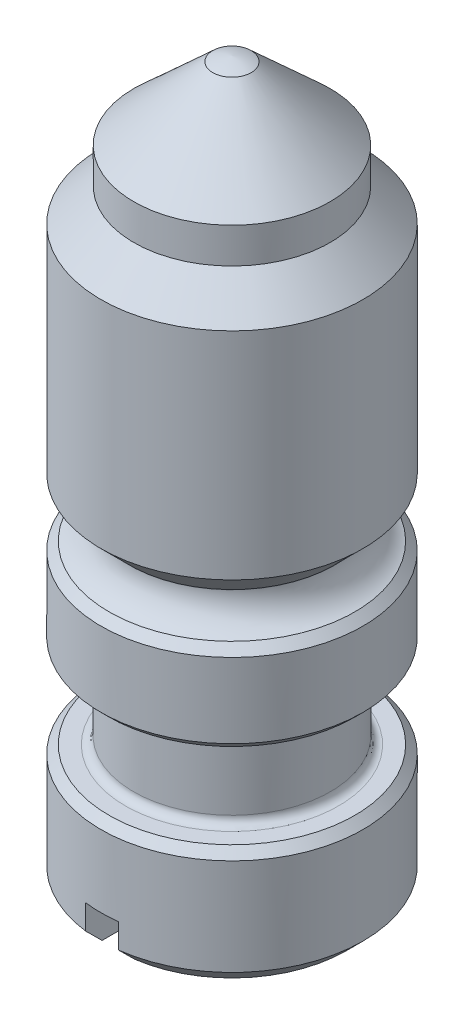
ISO-10303-21;
HEADER;
FILE_DESCRIPTION(('STEP AP214'),'2;1');
FILE_NAME('part.step','',(''),(''),'','','');
FILE_SCHEMA(('AUTOMOTIVE_DESIGN { 1 0 10303 214 1 1 1 1 }'));
ENDSEC;
DATA;
#1=APPLICATION_CONTEXT('core data for automotive mechanical design processes');
#2=APPLICATION_PROTOCOL_DEFINITION('international standard','automotive_design',2000,#1);
#3=PRODUCT_CONTEXT('',#1,'mechanical');
#4=PRODUCT('Part','Part','',(#3));
#5=PRODUCT_RELATED_PRODUCT_CATEGORY('part','',(#4));
#6=PRODUCT_DEFINITION_FORMATION('','',#4);
#7=PRODUCT_DEFINITION_CONTEXT('part definition',#1,'design');
#8=PRODUCT_DEFINITION('design','',#6,#7);
#9=PRODUCT_DEFINITION_SHAPE('','',#8);
#10=(LENGTH_UNIT() NAMED_UNIT(*) SI_UNIT(.MILLI.,.METRE.));
#11=(NAMED_UNIT(*) PLANE_ANGLE_UNIT() SI_UNIT($,.RADIAN.));
#12=(NAMED_UNIT(*) SI_UNIT($,.STERADIAN.) SOLID_ANGLE_UNIT());
#13=UNCERTAINTY_MEASURE_WITH_UNIT(LENGTH_MEASURE(1.E-05),#10,'distance_accuracy_value','');
#14=(GEOMETRIC_REPRESENTATION_CONTEXT(3) GLOBAL_UNCERTAINTY_ASSIGNED_CONTEXT((#13)) GLOBAL_UNIT_ASSIGNED_CONTEXT((#10,
#11,#12)) REPRESENTATION_CONTEXT('',''));
#15=CARTESIAN_POINT('',(0.,0.,0.));
#16=DIRECTION('',(0.,0.,1.));
#17=DIRECTION('',(1.,0.,0.));
#18=AXIS2_PLACEMENT_3D('',#15,#16,#17);
#19=CARTESIAN_POINT('',(0.,0.,0.));
#20=DIRECTION('',(0.,-1.,0.));
#21=DIRECTION('',(1.,0.,0.));
#22=AXIS2_PLACEMENT_3D('',#19,#20,#21);
#23=PLANE('',#22);
#24=DIRECTION('',(0.,0.,1.));
#25=VECTOR('',#24,1.);
#26=CARTESIAN_POINT('',(0.5,0.,-30.));
#27=LINE('',#26,#25);
#28=CARTESIAN_POINT('',(0.5,0.,-3.4612806175698));
#29=VERTEX_POINT('',#28);
#30=CARTESIAN_POINT('',(0.5,0.,3.4612806175698));
#31=VERTEX_POINT('',#30);
#32=EDGE_CURVE('E118',#29,#31,#27,.T.);
#33=ORIENTED_EDGE('',*,*,#32,.F.);
#34=CARTESIAN_POINT('',(0.,0.,0.));
#35=DIRECTION('',(0.,-1.,0.));
#36=DIRECTION('',(1.,0.,0.));
#37=AXIS2_PLACEMENT_3D('',#34,#35,#36);
#38=CIRCLE('',#37,3.49720795972507);
#39=EDGE_CURVE('E257',#29,#31,#38,.T.);
#40=ORIENTED_EDGE('',*,*,#39,.T.);
#41=EDGE_LOOP('',(#33,#40));
#42=FACE_BOUND('',#41,.T.);
#43=ADVANCED_FACE('F53',(#42),#23,.T.);
#44=CARTESIAN_POINT('',(0.,0.500000000000004,0.));
#45=DIRECTION('',(0.,1.,0.));
#46=DIRECTION('',(-1.,0.,0.));
#47=AXIS2_PLACEMENT_3D('',#44,#45,#46);
#48=CONICAL_SURFACE('',#47,3.99720795972507,0.785398163397449);
#49=CARTESIAN_POINT('',(0.5,0.500700000000004,-3.96651837943972));
#50=CARTESIAN_POINT('',(0.5,0.382162649200017,-3.84703862693179));
#51=CARTESIAN_POINT('',(0.5,0.263663328560872,-3.72752109644653));
#52=CARTESIAN_POINT('',(0.5,0.0267449401066083,-3.48834083826857));
#53=CARTESIAN_POINT('',(0.5,-0.0916740963278661,-3.36867807949517));
#54=CARTESIAN_POINT('',(0.5,-0.32901277920136,-3.12854544745988));
#55=CARTESIAN_POINT('',(0.5,-0.44793159702757,-3.00807475473469));
#56=CARTESIAN_POINT('',(0.5,-0.685518199811289,-2.76695112386457));
#57=CARTESIAN_POINT('',(0.5,-0.804186044562586,-2.64629824461754));
#58=CARTESIAN_POINT('',(0.5,-1.07827412353931,-2.36690025236017));
#59=CARTESIAN_POINT('',(0.5,-1.23358098505172,-2.20804363582366));
#60=CARTESIAN_POINT('',(0.5,-1.46585453324438,-1.96894497500237));
#61=CARTESIAN_POINT('',(0.5,-1.54320089466389,-1.8890719504622));
#62=CARTESIAN_POINT('',(0.5,-1.69751445923931,-1.72897558033324));
#63=CARTESIAN_POINT('',(0.5,-1.77448170027753,-1.6487522713212));
#64=CARTESIAN_POINT('',(0.5,-1.92753017553228,-1.48811310695071));
#65=CARTESIAN_POINT('',(0.5,-2.00361378404025,-1.407699515119));
#66=CARTESIAN_POINT('',(0.5,-2.15492880867202,-1.24601063177072));
#67=CARTESIAN_POINT('',(0.5,-2.23015988288688,-1.16473501819207));
#68=CARTESIAN_POINT('',(0.5,-2.34175217527641,-1.04180884388882));
#69=CARTESIAN_POINT('',(0.5,-2.3787094866305,-1.0007002419622));
#70=CARTESIAN_POINT('',(0.5,-2.45206232824094,-0.917985717558046));
#71=CARTESIAN_POINT('',(0.5,-2.48845788068998,-0.876379814842564));
#72=CARTESIAN_POINT('',(0.5,-2.56041345592791,-0.792495172606358));
#73=CARTESIAN_POINT('',(0.5,-2.59597398591856,-0.750216869138712));
#74=CARTESIAN_POINT('',(0.5,-2.66585622754197,-0.664651756728776));
#75=CARTESIAN_POINT('',(0.5,-2.70017825037921,-0.62136520569488));
#76=CARTESIAN_POINT('',(0.5,-2.74397216554048,-0.563422478281631));
#77=CARTESIAN_POINT('',(0.5,-2.75436408650383,-0.549462250981517));
#78=CARTESIAN_POINT('',(0.5,-2.77490234929231,-0.521361268943264));
#79=CARTESIAN_POINT('',(0.5,-2.78504867643563,-0.507220503489199));
#80=CARTESIAN_POINT('',(0.5,-2.81506384704984,-0.464472453232856));
#81=CARTESIAN_POINT('',(0.5,-2.8344971139177,-0.435554793331342));
#82=CARTESIAN_POINT('',(0.5,-2.87146068621362,-0.376925584117741));
#83=CARTESIAN_POINT('',(0.5,-2.88900841920581,-0.347225177104602));
#84=CARTESIAN_POINT('',(0.5,-2.92153281106069,-0.286461873986791));
#85=CARTESIAN_POINT('',(0.5,-2.93651278681223,-0.255400801676508));
#86=CARTESIAN_POINT('',(0.5,-2.96206655520625,-0.192772285233641));
#87=CARTESIAN_POINT('',(0.5,-2.97278118504339,-0.161264678483901));
#88=CARTESIAN_POINT('',(0.5,-2.98882239369144,-0.0970015844244616));
#89=CARTESIAN_POINT('',(0.5,-2.99417787989488,-0.064253791910037));
#90=CARTESIAN_POINT('',(0.5,-2.99830188173731,0.00199595398083887));
#91=CARTESIAN_POINT('',(0.5,-2.99700815695685,0.0355020997448063));
#92=CARTESIAN_POINT('',(0.5,-2.98803686977998,0.101719294008));
#93=CARTESIAN_POINT('',(0.5,-2.98033389282742,0.134426642708083));
#94=CARTESIAN_POINT('',(0.5,-2.96261773606055,0.190577409896189));
#95=CARTESIAN_POINT('',(0.5,-2.95360487047794,0.214357896203521));
#96=CARTESIAN_POINT('',(0.5,-2.93355246588525,0.261059362661849));
#97=CARTESIAN_POINT('',(0.5,-2.92251133941815,0.283979652522861));
#98=CARTESIAN_POINT('',(0.5,-2.89890850746196,0.329143337623807));
#99=CARTESIAN_POINT('',(0.5,-2.88634006768259,0.351383150875618));
#100=CARTESIAN_POINT('',(0.5,-2.86012413313005,0.395198055680793));
#101=CARTESIAN_POINT('',(0.5,-2.84647709985929,0.416773426099453));
#102=CARTESIAN_POINT('',(0.5,-2.79885989680542,0.489059531734577));
#103=CARTESIAN_POINT('',(0.5,-2.76303317281481,0.538538579517181));
#104=CARTESIAN_POINT('',(0.5,-2.68902382573166,0.635714801856385));
#105=CARTESIAN_POINT('',(0.5,-2.65083906050643,0.683410291096881));
#106=CARTESIAN_POINT('',(0.5,-2.57297856532151,0.777759896136569));
#107=CARTESIAN_POINT('',(0.5,-2.53329945148718,0.824411213106425));
#108=CARTESIAN_POINT('',(0.5,-2.45307269401154,0.916921552730882));
#109=CARTESIAN_POINT('',(0.5,-2.41252540965093,0.96278088946519));
#110=CARTESIAN_POINT('',(0.5,-2.33070347688188,1.05410856148117));
#111=CARTESIAN_POINT('',(0.5,-2.28942692350867,1.09957518675302));
#112=CARTESIAN_POINT('',(0.5,-2.20644554068812,1.19012335180082));
#113=CARTESIAN_POINT('',(0.5,-2.16474066863777,1.23520485243693));
#114=CARTESIAN_POINT('',(0.5,-2.03929387958965,1.36988729469155));
#115=CARTESIAN_POINT('',(0.5,-1.95509584150658,1.45906292827296));
#116=CARTESIAN_POINT('',(0.5,-1.77244599034555,1.65099855024569));
#117=CARTESIAN_POINT('',(0.5,-1.67387381164886,1.75364352186322));
#118=CARTESIAN_POINT('',(0.5,-1.47616709530086,1.95839355187308));
#119=CARTESIAN_POINT('',(0.5,-1.37703254690804,2.06049859988017));
#120=CARTESIAN_POINT('',(0.5,-1.07897741894879,2.366429553577));
#121=CARTESIAN_POINT('',(0.5,-0.87952997687716,2.56974158096011));
#122=CARTESIAN_POINT('',(0.5,-0.483416552129549,2.97223001890415));
#123=CARTESIAN_POINT('',(0.5,-0.286761714245419,3.17141742730143));
#124=CARTESIAN_POINT('',(0.5,0.106803658075433,3.56926770659997));
#125=CARTESIAN_POINT('',(0.5,0.303713922346927,3.76793084464976));
#126=CARTESIAN_POINT('',(0.5,0.500700000000002,3.96651837943972));
#127=B_SPLINE_CURVE_WITH_KNOTS('',3,(#49,#50,#51,#52,#53,#54,#55,#56,#57,#58,#59,#60,#61,#62,
#63,#64,#65,#66,#67,#68,#69,#70,#71,#72,#73,#74,#75,#76,#77,#78,#79,#80,#81,#82,#83,#84,#85,#86,
#87,#88,#89,#90,#91,#92,#93,#94,#95,#96,#97,#98,#99,#100,#101,#102,#103,#104,#105,#106,#107,
#108,#109,#110,#111,#112,#113,#114,#115,#116,#117,#118,#119,#120,#121,#122,#123,#124,#125,#126),
.UNSPECIFIED.,.F.,.F.,(4,2,2,2,2,2,2,2,2,2,2,2,2,2,2,2,2,2,2,2,2,2,2,2,2,2,2,2,2,2,2,2,2,2,2,2,
2,2,4),(0.,0.504914516325217,1.00996909558568,1.51780134402909,2.0254946138061,2.69197540948736,
3.02553046456375,3.359051485194,3.69115650239165,4.02339030503169,4.18922385253614,
4.35505083180991,4.52077433445986,4.6864559009669,4.73866383437256,4.79087488114598,
4.89535502966786,4.99876676154959,5.10204388832053,5.20155237937172,5.3005211774071,
5.40041805763787,5.50071295652808,5.57690080128118,5.65314853194459,5.72974556538846,
5.80631000053943,5.98940828960766,6.17267543123567,6.35638599028334,6.54002193897152,
6.72424262372849,6.90848181308941,7.27640655383883,7.70333717198028,8.1302759723256,
8.98469313412326,9.82441822511088,10.6635637349501),.UNSPECIFIED.);
#128=CARTESIAN_POINT('',(0.5,0.500000000000004,-3.96581283891329));
#129=VERTEX_POINT('',#128);
#130=EDGE_CURVE('E137',#129,#29,#127,.T.);
#131=ORIENTED_EDGE('',*,*,#130,.F.);
#132=CARTESIAN_POINT('',(0.,0.500000000000004,0.));
#133=DIRECTION('',(0.,-1.,0.));
#134=DIRECTION('',(1.,0.,0.));
#135=AXIS2_PLACEMENT_3D('',#132,#133,#134);
#136=CIRCLE('',#135,3.99720795972507);
#137=CARTESIAN_POINT('',(0.5,0.500000000000004,3.96581283891329));
#138=VERTEX_POINT('',#137);
#139=EDGE_CURVE('E270',#138,#129,#136,.F.);
#140=ORIENTED_EDGE('',*,*,#139,.F.);
#141=EDGE_CURVE('E139',#31,#138,#127,.T.);
#142=ORIENTED_EDGE('',*,*,#141,.F.);
#143=ORIENTED_EDGE('',*,*,#39,.F.);
#144=EDGE_LOOP('',(#131,#140,#142,#143));
#145=FACE_BOUND('',#144,.T.);
#146=ADVANCED_FACE('F214',(#145),#48,.T.);
#147=DIRECTION('',(0.,0.,1.));
#148=VECTOR('',#147,1.);
#149=CARTESIAN_POINT('',(-0.5,0.,-30.));
#150=LINE('',#149,#148);
#151=CARTESIAN_POINT('',(-0.5,0.,-3.4612806175698));
#152=VERTEX_POINT('',#151);
#153=CARTESIAN_POINT('',(-0.5,0.,3.4612806175698));
#154=VERTEX_POINT('',#153);
#155=EDGE_CURVE('E69',#152,#154,#150,.T.);
#156=ORIENTED_EDGE('',*,*,#155,.T.);
#157=EDGE_CURVE('E264',#154,#152,#38,.T.);
#158=ORIENTED_EDGE('',*,*,#157,.T.);
#159=EDGE_LOOP('',(#156,#158));
#160=FACE_BOUND('',#159,.T.);
#161=ADVANCED_FACE('F211',(#160),#23,.T.);
#162=CARTESIAN_POINT('',(0.,21.8840646651599,0.));
#163=DIRECTION('',(0.,1.,0.));
#164=DIRECTION('',(-1.,0.,0.));
#165=AXIS2_PLACEMENT_3D('',#162,#163,#164);
#166=CYLINDRICAL_SURFACE('',#165,3.99720795972507);
#167=DIRECTION('',(0.,1.,0.));
#168=VECTOR('',#167,1.);
#169=CARTESIAN_POINT('',(0.5,21.8840646651599,-3.96581283891329));
#170=LINE('',#169,#168);
#171=CARTESIAN_POINT('',(0.5,1.25,-3.96581283891329));
#172=VERTEX_POINT('',#171);
#173=EDGE_CURVE('E133',#172,#129,#170,.F.);
#174=ORIENTED_EDGE('',*,*,#173,.F.);
#175=CARTESIAN_POINT('',(0.,1.25,0.));
#176=DIRECTION('',(0.,1.,0.));
#177=DIRECTION('',(0.,0.,1.));
#178=AXIS2_PLACEMENT_3D('',#175,#176,#177);
#179=CIRCLE('',#178,3.99720795972507);
#180=CARTESIAN_POINT('',(-0.5,1.25,-3.96581283891329));
#181=VERTEX_POINT('',#180);
#182=EDGE_CURVE('E62',#181,#172,#179,.F.);
#183=ORIENTED_EDGE('',*,*,#182,.F.);
#184=DIRECTION('',(0.,1.,0.));
#185=VECTOR('',#184,1.);
#186=CARTESIAN_POINT('',(-0.5,21.8840646651599,-3.96581283891329));
#187=LINE('',#186,#185);
#188=CARTESIAN_POINT('',(-0.5,0.500000000000004,-3.96581283891329));
#189=VERTEX_POINT('',#188);
#190=EDGE_CURVE('E106',#189,#181,#187,.T.);
#191=ORIENTED_EDGE('',*,*,#190,.F.);
#192=CARTESIAN_POINT('',(-0.5,0.500000000000004,3.96581283891329));
#193=VERTEX_POINT('',#192);
#194=EDGE_CURVE('E265',#189,#193,#136,.F.);
#195=ORIENTED_EDGE('',*,*,#194,.T.);
#196=DIRECTION('',(0.,1.,0.));
#197=VECTOR('',#196,1.);
#198=CARTESIAN_POINT('',(-0.5,21.8840646651599,3.96581283891329));
#199=LINE('',#198,#197);
#200=CARTESIAN_POINT('',(-0.5,1.25,3.96581283891329));
#201=VERTEX_POINT('',#200);
#202=EDGE_CURVE('E117',#201,#193,#199,.F.);
#203=ORIENTED_EDGE('',*,*,#202,.F.);
#204=CARTESIAN_POINT('',(0.5,1.25,3.96581283891329));
#205=VERTEX_POINT('',#204);
#206=EDGE_CURVE('E125',#205,#201,#179,.F.);
#207=ORIENTED_EDGE('',*,*,#206,.F.);
#208=DIRECTION('',(0.,1.,0.));
#209=VECTOR('',#208,1.);
#210=CARTESIAN_POINT('',(0.5,21.8840646651599,3.96581283891329));
#211=LINE('',#210,#209);
#212=EDGE_CURVE('E340',#138,#205,#211,.T.);
#213=ORIENTED_EDGE('',*,*,#212,.F.);
#214=ORIENTED_EDGE('',*,*,#139,.T.);
#215=EDGE_LOOP('',(#174,#183,#191,#195,#203,#207,#213,#214));
#216=FACE_BOUND('',#215,.T.);
#217=CARTESIAN_POINT('',(0.,3.44572134300223,0.));
#218=DIRECTION('',(0.,1.,0.));
#219=DIRECTION('',(-1.,0.,0.));
#220=AXIS2_PLACEMENT_3D('',#217,#218,#219);
#221=CIRCLE('',#220,3.99720795972507);
#222=CARTESIAN_POINT('',(-3.99720795972507,3.44572134300223,0.));
#223=VERTEX_POINT('',#222);
#224=EDGE_CURVE('E278',#223,#223,#221,.F.);
#225=ORIENTED_EDGE('',*,*,#224,.T.);
#226=EDGE_LOOP('',(#225));
#227=FACE_BOUND('',#226,.T.);
#228=ADVANCED_FACE('F130',(#216,#227),#166,.T.);
#229=CARTESIAN_POINT('',(-3.,3.69572134300223,0.));
#230=DIRECTION('',(0.,1.,0.));
#231=DIRECTION('',(-1.,0.,0.));
#232=AXIS2_PLACEMENT_3D('',#229,#230,#231);
#233=PLANE('',#232);
#234=CARTESIAN_POINT('',(0.,3.69572134300223,0.));
#235=DIRECTION('',(0.,1.,0.));
#236=DIRECTION('',(-1.,0.,0.));
#237=AXIS2_PLACEMENT_3D('',#234,#235,#236);
#238=CIRCLE('',#237,3.74720795972507);
#239=CARTESIAN_POINT('',(-3.74720795972507,3.69572134300223,0.));
#240=VERTEX_POINT('',#239);
#241=EDGE_CURVE('E282',#240,#240,#238,.T.);
#242=ORIENTED_EDGE('',*,*,#241,.T.);
#243=EDGE_LOOP('',(#242));
#244=FACE_BOUND('',#243,.T.);
#245=CARTESIAN_POINT('',(0.,3.69572134300223,0.));
#246=DIRECTION('',(0.,1.,0.));
#247=DIRECTION('',(-1.,0.,0.));
#248=AXIS2_PLACEMENT_3D('',#245,#246,#247);
#249=CIRCLE('',#248,3.25);
#250=CARTESIAN_POINT('',(-3.25,3.69572134300223,0.));
#251=VERTEX_POINT('',#250);
#252=EDGE_CURVE('E298',#251,#251,#249,.F.);
#253=ORIENTED_EDGE('',*,*,#252,.T.);
#254=EDGE_LOOP('',(#253));
#255=FACE_BOUND('',#254,.T.);
#256=ADVANCED_FACE('F204',(#244,#255),#233,.T.);
#257=CARTESIAN_POINT('',(0.,21.8840646651599,0.));
#258=DIRECTION('',(0.,1.,0.));
#259=DIRECTION('',(-1.,0.,0.));
#260=AXIS2_PLACEMENT_3D('',#257,#258,#259);
#261=CYLINDRICAL_SURFACE('',#260,3.);
#262=CARTESIAN_POINT('',(0.,6.04080194293774,0.));
#263=DIRECTION('',(0.,-1.,0.));
#264=DIRECTION('',(1.,0.,0.));
#265=AXIS2_PLACEMENT_3D('',#262,#263,#264);
#266=CIRCLE('',#265,3.);
#267=CARTESIAN_POINT('',(3.,6.04080194293774,0.));
#268=VERTEX_POINT('',#267);
#269=EDGE_CURVE('E302',#268,#268,#266,.T.);
#270=ORIENTED_EDGE('',*,*,#269,.T.);
#271=EDGE_LOOP('',(#270));
#272=FACE_BOUND('',#271,.T.);
#273=CARTESIAN_POINT('',(0.,3.94572134300223,0.));
#274=DIRECTION('',(0.,1.,0.));
#275=DIRECTION('',(-1.,0.,0.));
#276=AXIS2_PLACEMENT_3D('',#273,#274,#275);
#277=CIRCLE('',#276,3.);
#278=CARTESIAN_POINT('',(-3.,3.94572134300223,0.));
#279=VERTEX_POINT('',#278);
#280=EDGE_CURVE('E306',#279,#279,#277,.T.);
#281=ORIENTED_EDGE('',*,*,#280,.T.);
#282=EDGE_LOOP('',(#281));
#283=FACE_BOUND('',#282,.T.);
#284=ADVANCED_FACE('F200',(#272,#283),#261,.T.);
#285=CARTESIAN_POINT('',(-3.9964906156496,6.29080194293774,0.));
#286=DIRECTION('',(0.,-1.,0.));
#287=DIRECTION('',(1.,0.,0.));
#288=AXIS2_PLACEMENT_3D('',#285,#286,#287);
#289=PLANE('',#288);
#290=CARTESIAN_POINT('',(0.,6.29080194293774,0.));
#291=DIRECTION('',(0.,-1.,0.));
#292=DIRECTION('',(1.,0.,0.));
#293=AXIS2_PLACEMENT_3D('',#290,#291,#292);
#294=CIRCLE('',#293,3.7464906156496);
#295=CARTESIAN_POINT('',(3.7464906156496,6.29080194293774,0.));
#296=VERTEX_POINT('',#295);
#297=EDGE_CURVE('E274',#296,#296,#294,.T.);
#298=ORIENTED_EDGE('',*,*,#297,.T.);
#299=EDGE_LOOP('',(#298));
#300=FACE_BOUND('',#299,.T.);
#301=CARTESIAN_POINT('',(0.,6.29080194293774,0.));
#302=DIRECTION('',(0.,-1.,0.));
#303=DIRECTION('',(1.,0.,0.));
#304=AXIS2_PLACEMENT_3D('',#301,#302,#303);
#305=CIRCLE('',#304,3.25);
#306=CARTESIAN_POINT('',(3.25,6.29080194293774,0.));
#307=VERTEX_POINT('',#306);
#308=EDGE_CURVE('E310',#307,#307,#305,.F.);
#309=ORIENTED_EDGE('',*,*,#308,.T.);
#310=EDGE_LOOP('',(#309));
#311=FACE_BOUND('',#310,.T.);
#312=ADVANCED_FACE('F196',(#300,#311),#289,.T.);
#313=CARTESIAN_POINT('',(0.,21.8840646651599,0.));
#314=DIRECTION('',(0.,1.,0.));
#315=DIRECTION('',(-1.,0.,0.));
#316=AXIS2_PLACEMENT_3D('',#313,#314,#315);
#317=CYLINDRICAL_SURFACE('',#316,3.99649061564959);
#318=CARTESIAN_POINT('',(0.,8.81960506322218,0.));
#319=DIRECTION('',(0.,1.,0.));
#320=DIRECTION('',(-1.,0.,0.));
#321=AXIS2_PLACEMENT_3D('',#318,#319,#320);
#322=CIRCLE('',#321,3.99649061564959);
#323=CARTESIAN_POINT('',(-3.9964906156496,8.81960506322218,0.));
#324=VERTEX_POINT('',#323);
#325=EDGE_CURVE('E286',#324,#324,#322,.F.);
#326=ORIENTED_EDGE('',*,*,#325,.T.);
#327=EDGE_LOOP('',(#326));
#328=FACE_BOUND('',#327,.T.);
#329=CARTESIAN_POINT('',(0.,6.54080194293774,0.));
#330=DIRECTION('',(0.,-1.,0.));
#331=DIRECTION('',(1.,0.,0.));
#332=AXIS2_PLACEMENT_3D('',#329,#330,#331);
#333=CIRCLE('',#332,3.99649061564959);
#334=CARTESIAN_POINT('',(3.99649061564959,6.54080194293774,0.));
#335=VERTEX_POINT('',#334);
#336=EDGE_CURVE('E290',#335,#335,#333,.F.);
#337=ORIENTED_EDGE('',*,*,#336,.T.);
#338=EDGE_LOOP('',(#337));
#339=FACE_BOUND('',#338,.T.);
#340=ADVANCED_FACE('F192',(#328,#339),#317,.T.);
#341=CARTESIAN_POINT('',(0.,21.8840646651599,0.));
#342=DIRECTION('',(0.,1.,0.));
#343=DIRECTION('',(-1.,0.,0.));
#344=AXIS2_PLACEMENT_3D('',#341,#342,#343);
#345=CYLINDRICAL_SURFACE('',#344,3.13);
#346=CARTESIAN_POINT('',(0.,9.99314204251169,0.));
#347=DIRECTION('',(0.,-1.,0.));
#348=DIRECTION('',(1.,0.,0.));
#349=AXIS2_PLACEMENT_3D('',#346,#347,#348);
#350=CIRCLE('',#349,3.13);
#351=CARTESIAN_POINT('',(3.13,9.99314204251169,0.));
#352=VERTEX_POINT('',#351);
#353=EDGE_CURVE('E11',#352,#352,#350,.F.);
#354=ORIENTED_EDGE('',*,*,#353,.T.);
#355=EDGE_LOOP('',(#354));
#356=FACE_BOUND('',#355,.T.);
#357=CARTESIAN_POINT('',(0.,10.0000000000001,0.));
#358=DIRECTION('',(0.,1.,0.));
#359=DIRECTION('',(-1.,0.,0.));
#360=AXIS2_PLACEMENT_3D('',#357,#358,#359);
#361=CIRCLE('',#360,3.13);
#362=CARTESIAN_POINT('',(-3.13,10.0000000000001,0.));
#363=VERTEX_POINT('',#362);
#364=EDGE_CURVE('E314',#363,#363,#361,.T.);
#365=ORIENTED_EDGE('',*,*,#364,.F.);
#366=EDGE_LOOP('',(#365));
#367=FACE_BOUND('',#366,.T.);
#368=ADVANCED_FACE('F188',(#356,#367),#345,.T.);
#369=CARTESIAN_POINT('',(0.,10.8670621086435,0.));
#370=DIRECTION('',(0.,1.,0.));
#371=DIRECTION('',(-1.,0.,0.));
#372=AXIS2_PLACEMENT_3D('',#369,#370,#371);
#373=CONICAL_SURFACE('',#372,3.99706210864335,0.785398163397451);
#374=ORIENTED_EDGE('',*,*,#364,.T.);
#375=EDGE_LOOP('',(#374));
#376=FACE_BOUND('',#375,.T.);
#377=CARTESIAN_POINT('',(0.,10.8670621086435,0.));
#378=DIRECTION('',(0.,1.,0.));
#379=DIRECTION('',(-1.,0.,0.));
#380=AXIS2_PLACEMENT_3D('',#377,#378,#379);
#381=CIRCLE('',#380,3.99706210864335);
#382=CARTESIAN_POINT('',(-3.99706210864335,10.8670621086435,0.));
#383=VERTEX_POINT('',#382);
#384=EDGE_CURVE('E318',#383,#383,#381,.T.);
#385=ORIENTED_EDGE('',*,*,#384,.F.);
#386=EDGE_LOOP('',(#385));
#387=FACE_BOUND('',#386,.T.);
#388=ADVANCED_FACE('F184',(#376,#387),#373,.T.);
#389=CARTESIAN_POINT('',(0.,21.8840646651599,0.));
#390=DIRECTION('',(0.,1.,0.));
#391=DIRECTION('',(-1.,0.,0.));
#392=AXIS2_PLACEMENT_3D('',#389,#390,#391);
#393=CYLINDRICAL_SURFACE('',#392,3.99706210864335);
#394=ORIENTED_EDGE('',*,*,#384,.T.);
#395=EDGE_LOOP('',(#394));
#396=FACE_BOUND('',#395,.T.);
#397=CARTESIAN_POINT('',(0.,17.4464527359772,0.));
#398=DIRECTION('',(0.,1.,0.));
#399=DIRECTION('',(-1.,0.,0.));
#400=AXIS2_PLACEMENT_3D('',#397,#398,#399);
#401=CIRCLE('',#400,3.99706210864335);
#402=CARTESIAN_POINT('',(-3.99706210864335,17.4464527359772,0.));
#403=VERTEX_POINT('',#402);
#404=EDGE_CURVE('E322',#403,#403,#401,.T.);
#405=ORIENTED_EDGE('',*,*,#404,.F.);
#406=EDGE_LOOP('',(#405));
#407=FACE_BOUND('',#406,.T.);
#408=ADVANCED_FACE('F180',(#396,#407),#393,.T.);
#409=CARTESIAN_POINT('',(0.,18.4500000000001,0.));
#410=DIRECTION('',(0.,-1.,0.));
#411=DIRECTION('',(1.,0.,0.));
#412=AXIS2_PLACEMENT_3D('',#409,#410,#411);
#413=CONICAL_SURFACE('',#412,2.99351484462045,0.785398163397442);
#414=ORIENTED_EDGE('',*,*,#404,.T.);
#415=EDGE_LOOP('',(#414));
#416=FACE_BOUND('',#415,.T.);
#417=CARTESIAN_POINT('',(0.,18.4500000000001,0.));
#418=DIRECTION('',(0.,1.,0.));
#419=DIRECTION('',(-1.,0.,0.));
#420=AXIS2_PLACEMENT_3D('',#417,#418,#419);
#421=CIRCLE('',#420,2.99351484462045);
#422=CARTESIAN_POINT('',(-2.99351484462045,18.4500000000001,0.));
#423=VERTEX_POINT('',#422);
#424=EDGE_CURVE('E326',#423,#423,#421,.T.);
#425=ORIENTED_EDGE('',*,*,#424,.F.);
#426=EDGE_LOOP('',(#425));
#427=FACE_BOUND('',#426,.T.);
#428=ADVANCED_FACE('F176',(#416,#427),#413,.T.);
#429=CARTESIAN_POINT('',(0.,21.8840646651599,0.));
#430=DIRECTION('',(0.,1.,0.));
#431=DIRECTION('',(-1.,0.,0.));
#432=AXIS2_PLACEMENT_3D('',#429,#430,#431);
#433=CYLINDRICAL_SURFACE('',#432,2.99351484462045);
#434=ORIENTED_EDGE('',*,*,#424,.T.);
#435=EDGE_LOOP('',(#434));
#436=FACE_BOUND('',#435,.T.);
#437=CARTESIAN_POINT('',(0.,19.5285432359588,0.));
#438=DIRECTION('',(0.,1.,0.));
#439=DIRECTION('',(-1.,0.,0.));
#440=AXIS2_PLACEMENT_3D('',#437,#438,#439);
#441=CIRCLE('',#440,2.99351484462045);
#442=CARTESIAN_POINT('',(2.99351484462044,19.5285432359588,0.));
#443=VERTEX_POINT('',#442);
#444=EDGE_CURVE('E330',#443,#443,#441,.T.);
#445=ORIENTED_EDGE('',*,*,#444,.F.);
#446=EDGE_LOOP('',(#445));
#447=FACE_BOUND('',#446,.T.);
#448=ADVANCED_FACE('F172',(#436,#447),#433,.T.);
#449=CARTESIAN_POINT('',(0.,21.7345876736024,0.));
#450=DIRECTION('',(0.,-1.,0.));
#451=DIRECTION('',(1.,0.,0.));
#452=AXIS2_PLACEMENT_3D('',#449,#450,#451);
#453=CONICAL_SURFACE('',#452,0.584226233195605,0.829406460299967);
#454=CARTESIAN_POINT('',(0.,21.7345876736024,0.));
#455=DIRECTION('',(0.,1.,0.));
#456=DIRECTION('',(-1.,0.,0.));
#457=AXIS2_PLACEMENT_3D('',#454,#455,#456);
#458=CIRCLE('',#457,0.584226233195605);
#459=CARTESIAN_POINT('',(0.584226233195601,21.7345876736024,0.));
#460=VERTEX_POINT('',#459);
#461=EDGE_CURVE('E334',#460,#460,#458,.T.);
#462=CARTESIAN_POINT('',(2.99351484462044,19.5285432359588,0.));
#463=CARTESIAN_POINT('',(2.96841808825143,19.5515228655176,0.));
#464=CARTESIAN_POINT('',(2.94332133188243,19.5745024950764,0.));
#465=CARTESIAN_POINT('',(2.89312781914441,19.6204617541939,0.));
#466=CARTESIAN_POINT('',(2.8680310627754,19.6434413837527,0.));
#467=CARTESIAN_POINT('',(2.81783755003738,19.6894006428703,0.));
#468=CARTESIAN_POINT('',(2.79274079366837,19.7123802724291,0.));
#469=CARTESIAN_POINT('',(2.74254728093036,19.7583395315467,0.));
#470=CARTESIAN_POINT('',(2.71745052456135,19.7813191611054,0.));
#471=CARTESIAN_POINT('',(2.66725701182333,19.827278420223,0.));
#472=CARTESIAN_POINT('',(2.64216025545432,19.8502580497818,0.));
#473=CARTESIAN_POINT('',(2.5919667427163,19.8962173088994,0.));
#474=CARTESIAN_POINT('',(2.56686998634729,19.9191969384582,0.));
#475=CARTESIAN_POINT('',(2.51667647360928,19.9651561975757,0.));
#476=CARTESIAN_POINT('',(2.49157971724027,19.9881358271345,0.));
#477=CARTESIAN_POINT('',(2.44138620450225,20.0340950862521,0.));
#478=CARTESIAN_POINT('',(2.41628944813324,20.0570747158109,0.));
#479=CARTESIAN_POINT('',(2.36609593539522,20.1030339749285,0.));
#480=CARTESIAN_POINT('',(2.34099917902622,20.1260136044873,0.));
#481=CARTESIAN_POINT('',(2.2908056662882,20.1719728636048,0.));
#482=CARTESIAN_POINT('',(2.26570890991919,20.1949524931636,0.));
#483=CARTESIAN_POINT('',(2.21551539718117,20.2409117522812,0.));
#484=CARTESIAN_POINT('',(2.19041864081216,20.26389138184,0.));
#485=CARTESIAN_POINT('',(2.14022512807414,20.3098506409576,0.));
#486=CARTESIAN_POINT('',(2.11512837170514,20.3328302705163,0.));
#487=CARTESIAN_POINT('',(2.06493485896712,20.3787895296339,0.));
#488=CARTESIAN_POINT('',(2.03983810259811,20.4017691591927,0.));
#489=CARTESIAN_POINT('',(1.98964458986009,20.4477284183103,0.));
#490=CARTESIAN_POINT('',(1.96454783349108,20.4707080478691,0.));
#491=CARTESIAN_POINT('',(1.91435432075307,20.5166673069866,0.));
#492=CARTESIAN_POINT('',(1.88925756438406,20.5396469365454,0.));
#493=CARTESIAN_POINT('',(1.83906405164604,20.585606195663,0.));
#494=CARTESIAN_POINT('',(1.81396729527703,20.6085858252218,0.));
#495=CARTESIAN_POINT('',(1.76377378253901,20.6545450843394,0.));
#496=CARTESIAN_POINT('',(1.73867702617,20.6775247138982,0.));
#497=CARTESIAN_POINT('',(1.68848351343199,20.7234839730157,0.));
#498=CARTESIAN_POINT('',(1.66338675706298,20.7464636025745,0.));
#499=CARTESIAN_POINT('',(1.61319324432496,20.7924228616921,0.));
#500=CARTESIAN_POINT('',(1.58809648795595,20.8154024912509,0.));
#501=CARTESIAN_POINT('',(1.53790297521793,20.8613617503685,0.));
#502=CARTESIAN_POINT('',(1.51280621884893,20.8843413799272,0.));
#503=CARTESIAN_POINT('',(1.46261270611091,20.9303006390448,0.));
#504=CARTESIAN_POINT('',(1.4375159497419,20.9532802686036,0.));
#505=CARTESIAN_POINT('',(1.38732243700388,20.9992395277212,0.));
#506=CARTESIAN_POINT('',(1.36222568063487,21.02221915728,0.));
#507=CARTESIAN_POINT('',(1.31203216789686,21.0681784163975,0.));
#508=CARTESIAN_POINT('',(1.28693541152785,21.0911580459563,0.));
#509=CARTESIAN_POINT('',(1.23674189878983,21.1371173050739,0.));
#510=CARTESIAN_POINT('',(1.21164514242082,21.1600969346327,0.));
#511=CARTESIAN_POINT('',(1.1614516296828,21.2060561937503,0.));
#512=CARTESIAN_POINT('',(1.13635487331379,21.2290358233091,0.));
#513=CARTESIAN_POINT('',(1.08616136057578,21.2749950824266,0.));
#514=CARTESIAN_POINT('',(1.06106460420677,21.2979747119854,0.));
#515=CARTESIAN_POINT('',(1.01087109146875,21.343933971103,0.));
#516=CARTESIAN_POINT('',(0.985774335099741,21.3669136006618,0.));
#517=CARTESIAN_POINT('',(0.935580822361723,21.4128728597794,0.));
#518=CARTESIAN_POINT('',(0.910484065992714,21.4358524893381,0.));
#519=CARTESIAN_POINT('',(0.860290553254697,21.4818117484557,0.));
#520=CARTESIAN_POINT('',(0.835193796885688,21.5047913780145,0.));
#521=CARTESIAN_POINT('',(0.785000284147671,21.5507506371321,0.));
#522=CARTESIAN_POINT('',(0.759903527778662,21.5737302666909,0.));
#523=CARTESIAN_POINT('',(0.709710015040644,21.6196895258084,0.));
#524=CARTESIAN_POINT('',(0.684613258671636,21.6426691553672,0.));
#525=CARTESIAN_POINT('',(0.634419745933618,21.6886284144848,0.));
#526=CARTESIAN_POINT('',(0.60932298956461,21.7116080440436,0.));
#527=CARTESIAN_POINT('',(0.584226233195601,21.7345876736024,0.));
#528=B_SPLINE_CURVE_WITH_KNOTS('',3,(#462,#463,#464,#465,#466,#467,#468,#469,#470,#471,#472,
#473,#474,#475,#476,#477,#478,#479,#480,#481,#482,#483,#484,#485,#486,#487,#488,#489,#490,#491,
#492,#493,#494,#495,#496,#497,#498,#499,#500,#501,#502,#503,#504,#505,#506,#507,#508,#509,#510,
#511,#512,#513,#514,#515,#516,#517,#518,#519,#520,#521,#522,#523,#524,#525,#526,#527),
.UNSPECIFIED.,.F.,.F.,(4,2,2,2,2,2,2,2,2,2,2,2,2,2,2,2,2,2,2,2,2,2,2,2,2,2,2,2,2,2,2,2,4),(0.,
0.102084254388911,0.204168508777824,0.306252763166738,0.408337017555651,0.510421271944565,
0.612505526333478,0.714589780722391,0.816674035111305,0.918758289500218,1.02084254388913,
1.12292679827804,1.22501105266696,1.32709530705587,1.42917956144478,1.5312638158337,
1.63334807022261,1.73543232461152,1.83751657900044,1.93960083338935,2.04168508777826,
2.14376934216717,2.24585359655609,2.347937850945,2.45002210533391,2.55210635972283,
2.65419061411174,2.75627486850065,2.85835912288957,2.96044337727848,3.06252763166739,
3.16461188605631,3.26669614044522),.UNSPECIFIED.);
#529=EDGE_CURVE('BSEAM168',#443,#460,#528,.T.);
#530=ORIENTED_EDGE('',*,*,#444,.T.);
#531=ORIENTED_EDGE('',*,*,#461,.F.);
#532=ORIENTED_EDGE('',*,*,#529,.T.);
#533=ORIENTED_EDGE('',*,*,#529,.F.);
#534=EDGE_LOOP('',(#530,#532,#531,#533));
#535=FACE_BOUND('',#534,.T.);
#536=ADVANCED_FACE('F168',(#535),#453,.T.);
#537=CARTESIAN_POINT('',(0.212780103334326,19.835966517348,0.));
#538=DIRECTION('',(0.,0.,-1.));
#539=DIRECTION('',(-1.,0.,0.));
#540=AXIS2_PLACEMENT_3D('',#537,#538,#539);
#541=CIRCLE('',#540,2.05912151060731);
#542=TRIMMED_CURVE('',#541,(PARAMETER_VALUE(-1.46727615165489)),
(PARAMETER_VALUE(1.46727615165489)),.T.,.PARAMETER.);
#543=CARTESIAN_POINT('',(0.,19.835966517348,0.));
#544=DIRECTION('',(0.,1.,0.));
#545=AXIS1_PLACEMENT('',#543,#544);
#546=SURFACE_OF_REVOLUTION('',#542,#545);
#547=ORIENTED_EDGE('',*,*,#461,.T.);
#548=EDGE_LOOP('',(#547));
#549=FACE_BOUND('',#548,.T.);
#550=CARTESIAN_POINT('',(0.,21.8840646651599,0.));
#551=VERTEX_POINT('',#550);
#552=VERTEX_LOOP('',#551);
#553=FACE_BOUND('',#552,.T.);
#554=ADVANCED_FACE('F164',(#549,#553),#546,.T.);
#555=CARTESIAN_POINT('',(0.,6.04080194293774,0.));
#556=DIRECTION('',(0.,-1.,0.));
#557=DIRECTION('',(1.,0.,0.));
#558=AXIS2_PLACEMENT_3D('',#555,#556,#557);
#559=TOROIDAL_SURFACE('',#558,3.25,0.25);
#560=ORIENTED_EDGE('',*,*,#269,.F.);
#561=EDGE_LOOP('',(#560));
#562=FACE_BOUND('',#561,.T.);
#563=ORIENTED_EDGE('',*,*,#308,.F.);
#564=EDGE_LOOP('',(#563));
#565=FACE_BOUND('',#564,.T.);
#566=ADVANCED_FACE('F167',(#562,#565),#559,.F.);
#567=CARTESIAN_POINT('',(0.,3.94572134300223,0.));
#568=DIRECTION('',(0.,1.,0.));
#569=DIRECTION('',(-1.,0.,0.));
#570=AXIS2_PLACEMENT_3D('',#567,#568,#569);
#571=TOROIDAL_SURFACE('',#570,3.25,0.25);
#572=ORIENTED_EDGE('',*,*,#252,.F.);
#573=EDGE_LOOP('',(#572));
#574=FACE_BOUND('',#573,.T.);
#575=ORIENTED_EDGE('',*,*,#280,.F.);
#576=EDGE_LOOP('',(#575));
#577=FACE_BOUND('',#576,.T.);
#578=ADVANCED_FACE('F218',(#574,#577),#571,.F.);
#579=CARTESIAN_POINT('',(0.,9.06960506322219,0.));
#580=DIRECTION('',(0.,-1.,0.));
#581=DIRECTION('',(1.,0.,0.));
#582=AXIS2_PLACEMENT_3D('',#579,#580,#581);
#583=CONICAL_SURFACE('',#582,3.74649061564959,0.785398163397448);
#584=ORIENTED_EDGE('',*,*,#325,.F.);
#585=EDGE_LOOP('',(#584));
#586=FACE_BOUND('',#585,.T.);
#587=CARTESIAN_POINT('',(0.,9.06960506322219,0.));
#588=DIRECTION('',(0.,1.,0.));
#589=DIRECTION('',(-1.,0.,0.));
#590=AXIS2_PLACEMENT_3D('',#587,#588,#589);
#591=CIRCLE('',#590,3.74649061564959);
#592=CARTESIAN_POINT('',(-3.74649061564959,9.06960506322219,0.));
#593=VERTEX_POINT('',#592);
#594=EDGE_CURVE('E294',#593,#593,#591,.T.);
#595=ORIENTED_EDGE('',*,*,#594,.F.);
#596=EDGE_LOOP('',(#595));
#597=FACE_BOUND('',#596,.T.);
#598=ADVANCED_FACE('F222',(#586,#597),#583,.T.);
#599=CARTESIAN_POINT('',(0.,3.69572134300223,0.));
#600=DIRECTION('',(0.,-1.,0.));
#601=DIRECTION('',(1.,0.,0.));
#602=AXIS2_PLACEMENT_3D('',#599,#600,#601);
#603=CONICAL_SURFACE('',#602,3.74720795972507,0.78539816339745);
#604=ORIENTED_EDGE('',*,*,#224,.F.);
#605=EDGE_LOOP('',(#604));
#606=FACE_BOUND('',#605,.T.);
#607=ORIENTED_EDGE('',*,*,#241,.F.);
#608=EDGE_LOOP('',(#607));
#609=FACE_BOUND('',#608,.T.);
#610=ADVANCED_FACE('F230',(#606,#609),#603,.T.);
#611=CARTESIAN_POINT('',(0.,6.54080194293774,0.));
#612=DIRECTION('',(0.,1.,0.));
#613=DIRECTION('',(-1.,0.,0.));
#614=AXIS2_PLACEMENT_3D('',#611,#612,#613);
#615=CONICAL_SURFACE('',#614,3.99649061564959,0.785398163397443);
#616=ORIENTED_EDGE('',*,*,#297,.F.);
#617=EDGE_LOOP('',(#616));
#618=FACE_BOUND('',#617,.T.);
#619=ORIENTED_EDGE('',*,*,#336,.F.);
#620=EDGE_LOOP('',(#619));
#621=FACE_BOUND('',#620,.T.);
#622=ADVANCED_FACE('F236',(#618,#621),#615,.T.);
#623=CARTESIAN_POINT('',(-0.5,0.500700000000004,3.96651837943972));
#624=CARTESIAN_POINT('',(-0.5,0.382162649200017,3.84703862693179));
#625=CARTESIAN_POINT('',(-0.5,0.263663328560873,3.72752109644653));
#626=CARTESIAN_POINT('',(-0.5,0.0267449401066098,3.48834083826857));
#627=CARTESIAN_POINT('',(-0.5,-0.0916740963278642,3.36867807949518));
#628=CARTESIAN_POINT('',(-0.5,-0.329012779201357,3.12854544745989));
#629=CARTESIAN_POINT('',(-0.5,-0.447931597027567,3.00807475473469));
#630=CARTESIAN_POINT('',(-0.5,-0.685518199811286,2.76695112386457));
#631=CARTESIAN_POINT('',(-0.5,-0.804186044562582,2.64629824461754));
#632=CARTESIAN_POINT('',(-0.5,-1.07827412353931,2.36690025236018));
#633=CARTESIAN_POINT('',(-0.5,-1.23358098505172,2.20804363582366));
#634=CARTESIAN_POINT('',(-0.5,-1.46585453324438,1.96894497500237));
#635=CARTESIAN_POINT('',(-0.5,-1.54320089466389,1.8890719504622));
#636=CARTESIAN_POINT('',(-0.5,-1.69751445923931,1.72897558033324));
#637=CARTESIAN_POINT('',(-0.5,-1.77448170027753,1.6487522713212));
#638=CARTESIAN_POINT('',(-0.5,-1.92753017553228,1.48811310695071));
#639=CARTESIAN_POINT('',(-0.5,-2.00361378404025,1.407699515119));
#640=CARTESIAN_POINT('',(-0.5,-2.15492880867202,1.24601063177072));
#641=CARTESIAN_POINT('',(-0.5,-2.23015988288688,1.16473501819207));
#642=CARTESIAN_POINT('',(-0.5,-2.34175217527641,1.04180884388882));
#643=CARTESIAN_POINT('',(-0.5,-2.3787094866305,1.0007002419622));
#644=CARTESIAN_POINT('',(-0.5,-2.45206232824094,0.917985717558045));
#645=CARTESIAN_POINT('',(-0.5,-2.48845788068998,0.876379814842564));
#646=CARTESIAN_POINT('',(-0.5,-2.56041345592791,0.792495172606358));
#647=CARTESIAN_POINT('',(-0.5,-2.59597398591856,0.750216869138713));
#648=CARTESIAN_POINT('',(-0.5,-2.66585622754197,0.664651756728776));
#649=CARTESIAN_POINT('',(-0.5,-2.70017825037921,0.62136520569488));
#650=CARTESIAN_POINT('',(-0.5,-2.74397216554048,0.563422478281631));
#651=CARTESIAN_POINT('',(-0.5,-2.75436408650383,0.549462250981517));
#652=CARTESIAN_POINT('',(-0.5,-2.77490234929231,0.521361268943264));
#653=CARTESIAN_POINT('',(-0.5,-2.78504867643563,0.507220503489199));
#654=CARTESIAN_POINT('',(-0.5,-2.81506384704984,0.464472453232856));
#655=CARTESIAN_POINT('',(-0.5,-2.8344971139177,0.435554793331341));
#656=CARTESIAN_POINT('',(-0.5,-2.87146068621362,0.376925584117741));
#657=CARTESIAN_POINT('',(-0.5,-2.88900841920581,0.347225177104601));
#658=CARTESIAN_POINT('',(-0.5,-2.92153281106069,0.286461873986791));
#659=CARTESIAN_POINT('',(-0.5,-2.93651278681223,0.255400801676508));
#660=CARTESIAN_POINT('',(-0.5,-2.96206655520625,0.19277228523364));
#661=CARTESIAN_POINT('',(-0.5,-2.97278118504339,0.1612646784839));
#662=CARTESIAN_POINT('',(-0.5,-2.98882239369144,0.0970015844244605));
#663=CARTESIAN_POINT('',(-0.5,-2.99417787989488,0.0642537919100361));
#664=CARTESIAN_POINT('',(-0.5,-2.99830188173731,-0.00199595398083966));
#665=CARTESIAN_POINT('',(-0.5,-2.99700815695685,-0.035502099744807));
#666=CARTESIAN_POINT('',(-0.5,-2.98803686977998,-0.101719294008));
#667=CARTESIAN_POINT('',(-0.5,-2.98033389282742,-0.134426642708084));
#668=CARTESIAN_POINT('',(-0.5,-2.96261773606055,-0.19057740989619));
#669=CARTESIAN_POINT('',(-0.5,-2.95360487047794,-0.214357896203522));
#670=CARTESIAN_POINT('',(-0.5,-2.93355246588525,-0.261059362661851));
#671=CARTESIAN_POINT('',(-0.5,-2.92251133941815,-0.283979652522863));
#672=CARTESIAN_POINT('',(-0.5,-2.89890850746196,-0.329143337623809));
#673=CARTESIAN_POINT('',(-0.5,-2.88634006768259,-0.35138315087562));
#674=CARTESIAN_POINT('',(-0.5,-2.86012413313005,-0.395198055680794));
#675=CARTESIAN_POINT('',(-0.5,-2.84647709985929,-0.416773426099454));
#676=CARTESIAN_POINT('',(-0.5,-2.79885989680542,-0.489059531734579));
#677=CARTESIAN_POINT('',(-0.5,-2.76303317281481,-0.538538579517183));
#678=CARTESIAN_POINT('',(-0.5,-2.68902382573165,-0.635714801856387));
#679=CARTESIAN_POINT('',(-0.5,-2.65083906050643,-0.683410291096883));
#680=CARTESIAN_POINT('',(-0.5,-2.57297856532151,-0.777759896136572));
#681=CARTESIAN_POINT('',(-0.5,-2.53329945148718,-0.824411213106429));
#682=CARTESIAN_POINT('',(-0.5,-2.45307269401154,-0.916921552730886));
#683=CARTESIAN_POINT('',(-0.5,-2.41252540965093,-0.962780889465194));
#684=CARTESIAN_POINT('',(-0.5,-2.33070347688187,-1.05410856148117));
#685=CARTESIAN_POINT('',(-0.5,-2.28942692350866,-1.09957518675303));
#686=CARTESIAN_POINT('',(-0.5,-2.20644554068812,-1.19012335180083));
#687=CARTESIAN_POINT('',(-0.5,-2.16474066863777,-1.23520485243694));
#688=CARTESIAN_POINT('',(-0.5,-2.03929387958965,-1.36988729469155));
#689=CARTESIAN_POINT('',(-0.5,-1.95509584150658,-1.45906292827297));
#690=CARTESIAN_POINT('',(-0.5,-1.77244599034555,-1.6509985502457));
#691=CARTESIAN_POINT('',(-0.5,-1.67387381164885,-1.75364352186322));
#692=CARTESIAN_POINT('',(-0.5,-1.47616709530085,-1.95839355187308));
#693=CARTESIAN_POINT('',(-0.5,-1.37703254690803,-2.06049859988018));
#694=CARTESIAN_POINT('',(-0.5,-1.07897741894878,-2.366429553577));
#695=CARTESIAN_POINT('',(-0.5,-0.879529976877158,-2.56974158096012));
#696=CARTESIAN_POINT('',(-0.5,-0.483416552129548,-2.97223001890415));
#697=CARTESIAN_POINT('',(-0.5,-0.286761714245418,-3.17141742730143));
#698=CARTESIAN_POINT('',(-0.5,0.106803658075433,-3.56926770659997));
#699=CARTESIAN_POINT('',(-0.5,0.303713922346926,-3.76793084464976));
#700=CARTESIAN_POINT('',(-0.5,0.500700000000002,-3.96651837943972));
#701=B_SPLINE_CURVE_WITH_KNOTS('',3,(#623,#624,#625,#626,#627,#628,#629,#630,#631,#632,#633,
#634,#635,#636,#637,#638,#639,#640,#641,#642,#643,#644,#645,#646,#647,#648,#649,#650,#651,#652,
#653,#654,#655,#656,#657,#658,#659,#660,#661,#662,#663,#664,#665,#666,#667,#668,#669,#670,#671,
#672,#673,#674,#675,#676,#677,#678,#679,#680,#681,#682,#683,#684,#685,#686,#687,#688,#689,#690,
#691,#692,#693,#694,#695,#696,#697,#698,#699,#700),.UNSPECIFIED.,.F.,.F.,(4,2,2,2,2,2,2,2,2,2,2,
2,2,2,2,2,2,2,2,2,2,2,2,2,2,2,2,2,2,2,2,2,2,2,2,2,2,2,4),(0.,0.504914516325215,1.00996909558568,
1.51780134402908,2.0254946138061,2.69197540948735,3.02553046456375,3.359051485194,
3.69115650239165,4.02339030503169,4.18922385253614,4.35505083180991,4.52077433445986,
4.68645590096691,4.73866383437256,4.79087488114598,4.89535502966786,4.99876676154959,
5.10204388832053,5.20155237937172,5.3005211774071,5.40041805763788,5.50071295652808,
5.57690080128118,5.65314853194459,5.72974556538846,5.80631000053944,5.98940828960767,
6.17267543123567,6.35638599028335,6.54002193897153,6.72424262372849,6.90848181308943,
7.27640655383884,7.70333717198029,8.13027597232561,8.98469313412326,9.82441822511088,
10.6635637349501),.UNSPECIFIED.);
#702=EDGE_CURVE('E147',#193,#154,#701,.T.);
#703=ORIENTED_EDGE('',*,*,#702,.F.);
#704=ORIENTED_EDGE('',*,*,#194,.F.);
#705=EDGE_CURVE('E111',#152,#189,#701,.T.);
#706=ORIENTED_EDGE('',*,*,#705,.F.);
#707=ORIENTED_EDGE('',*,*,#157,.F.);
#708=EDGE_LOOP('',(#703,#704,#706,#707));
#709=FACE_BOUND('',#708,.T.);
#710=ADVANCED_FACE('F155',(#709),#48,.T.);
#711=CARTESIAN_POINT('',(0.5,1.25,-30.));
#712=DIRECTION('',(1.,0.,0.));
#713=DIRECTION('',(0.,0.,-1.));
#714=AXIS2_PLACEMENT_3D('',#711,#712,#713);
#715=PLANE('',#714);
#716=ORIENTED_EDGE('',*,*,#173,.T.);
#717=ORIENTED_EDGE('',*,*,#130,.T.);
#718=ORIENTED_EDGE('',*,*,#32,.T.);
#719=ORIENTED_EDGE('',*,*,#141,.T.);
#720=ORIENTED_EDGE('',*,*,#212,.T.);
#721=DIRECTION('',(0.,0.,1.));
#722=VECTOR('',#721,1.);
#723=CARTESIAN_POINT('',(0.5,1.25,-30.));
#724=LINE('',#723,#722);
#725=EDGE_CURVE('E127',#172,#205,#724,.T.);
#726=ORIENTED_EDGE('',*,*,#725,.F.);
#727=EDGE_LOOP('',(#716,#717,#718,#719,#720,#726));
#728=FACE_BOUND('',#727,.T.);
#729=ADVANCED_FACE('F158',(#728),#715,.F.);
#730=CARTESIAN_POINT('',(-0.5,1.25,-30.));
#731=DIRECTION('',(-1.,0.,0.));
#732=DIRECTION('',(0.,0.,1.));
#733=AXIS2_PLACEMENT_3D('',#730,#731,#732);
#734=PLANE('',#733);
#735=ORIENTED_EDGE('',*,*,#202,.T.);
#736=ORIENTED_EDGE('',*,*,#702,.T.);
#737=ORIENTED_EDGE('',*,*,#155,.F.);
#738=ORIENTED_EDGE('',*,*,#705,.T.);
#739=ORIENTED_EDGE('',*,*,#190,.T.);
#740=DIRECTION('',(0.,0.,1.));
#741=VECTOR('',#740,1.);
#742=CARTESIAN_POINT('',(-0.5,1.25,-30.));
#743=LINE('',#742,#741);
#744=EDGE_CURVE('E109',#181,#201,#743,.T.);
#745=ORIENTED_EDGE('',*,*,#744,.T.);
#746=EDGE_LOOP('',(#735,#736,#737,#738,#739,#745));
#747=FACE_BOUND('',#746,.T.);
#748=ADVANCED_FACE('F108',(#747),#734,.F.);
#749=CARTESIAN_POINT('',(-0.5,1.25,-30.));
#750=DIRECTION('',(0.,1.,0.));
#751=DIRECTION('',(0.,0.,1.));
#752=AXIS2_PLACEMENT_3D('',#749,#750,#751);
#753=PLANE('',#752);
#754=ORIENTED_EDGE('',*,*,#182,.T.);
#755=ORIENTED_EDGE('',*,*,#725,.T.);
#756=ORIENTED_EDGE('',*,*,#206,.T.);
#757=ORIENTED_EDGE('',*,*,#744,.F.);
#758=EDGE_LOOP('',(#754,#755,#756,#757));
#759=FACE_BOUND('',#758,.T.);
#760=ADVANCED_FACE('F121',(#759),#753,.F.);
#761=CARTESIAN_POINT('',(0.,9.99314204251169,0.));
#762=DIRECTION('',(0.,-1.,0.));
#763=DIRECTION('',(1.,0.,0.));
#764=AXIS2_PLACEMENT_3D('',#761,#762,#763);
#765=TOROIDAL_SURFACE('',#764,4.13,1.);
#766=ORIENTED_EDGE('',*,*,#594,.T.);
#767=EDGE_LOOP('',(#766));
#768=FACE_BOUND('',#767,.T.);
#769=ORIENTED_EDGE('',*,*,#353,.F.);
#770=EDGE_LOOP('',(#769));
#771=FACE_BOUND('',#770,.T.);
#772=ADVANCED_FACE('F55',(#768,#771),#765,.F.);
#773=CLOSED_SHELL('',(#43,#146,#161,#228,#256,#284,#312,#340,#368,#388,#408,#428,#448,#536,#554,
#566,#578,#598,#610,#622,#710,#729,#748,#760,#772));
#774=MANIFOLD_SOLID_BREP('B2',#773);
#775=ADVANCED_BREP_SHAPE_REPRESENTATION('',(#18,#774),#14);
#776=SHAPE_DEFINITION_REPRESENTATION(#9,#775);
ENDSEC;
END-ISO-10303-21;
